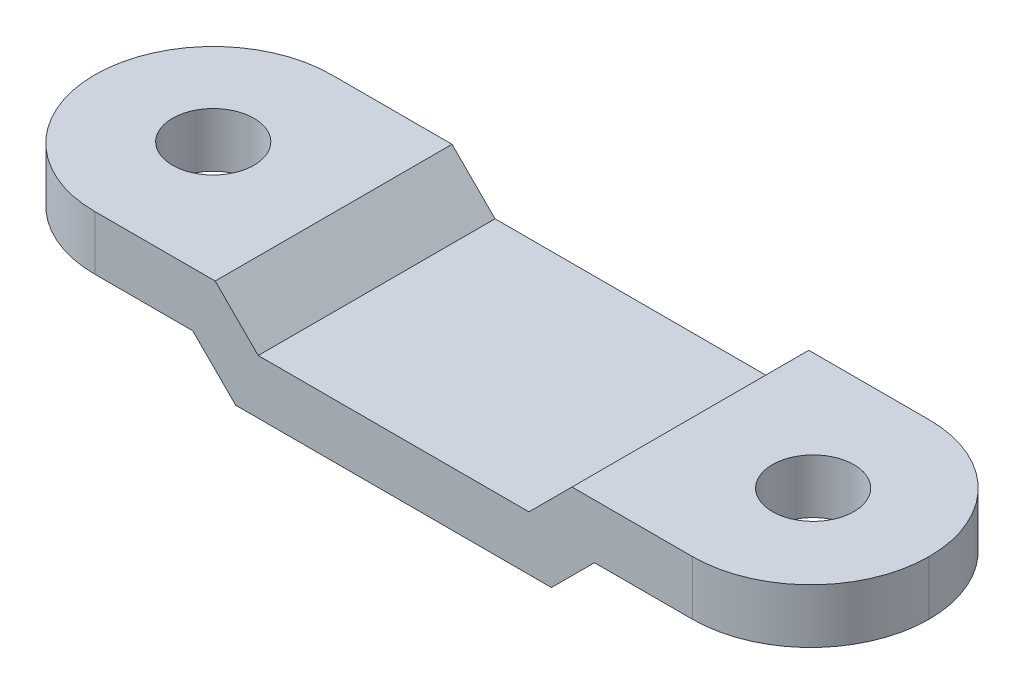
ISO-10303-21;
HEADER;
FILE_DESCRIPTION(('STEP AP214'),'2;1');
FILE_NAME('part.step','',(''),(''),'','','');
FILE_SCHEMA(('AUTOMOTIVE_DESIGN { 1 0 10303 214 1 1 1 1 }'));
ENDSEC;
DATA;
#1=APPLICATION_CONTEXT('core data for automotive mechanical design processes');
#2=APPLICATION_PROTOCOL_DEFINITION('international standard','automotive_design',2000,#1);
#3=PRODUCT_CONTEXT('',#1,'mechanical');
#4=PRODUCT('Part','Part','',(#3));
#5=PRODUCT_RELATED_PRODUCT_CATEGORY('part','',(#4));
#6=PRODUCT_DEFINITION_FORMATION('','',#4);
#7=PRODUCT_DEFINITION_CONTEXT('part definition',#1,'design');
#8=PRODUCT_DEFINITION('design','',#6,#7);
#9=PRODUCT_DEFINITION_SHAPE('','',#8);
#10=(LENGTH_UNIT() NAMED_UNIT(*) SI_UNIT(.MILLI.,.METRE.));
#11=(NAMED_UNIT(*) PLANE_ANGLE_UNIT() SI_UNIT($,.RADIAN.));
#12=(NAMED_UNIT(*) SI_UNIT($,.STERADIAN.) SOLID_ANGLE_UNIT());
#13=UNCERTAINTY_MEASURE_WITH_UNIT(LENGTH_MEASURE(1.E-05),#10,'distance_accuracy_value','');
#14=(GEOMETRIC_REPRESENTATION_CONTEXT(3) GLOBAL_UNCERTAINTY_ASSIGNED_CONTEXT((#13)) GLOBAL_UNIT_ASSIGNED_CONTEXT((#10,
#11,#12)) REPRESENTATION_CONTEXT('',''));
#15=CARTESIAN_POINT('',(0.,0.,0.));
#16=DIRECTION('',(0.,0.,1.));
#17=DIRECTION('',(1.,0.,0.));
#18=AXIS2_PLACEMENT_3D('',#15,#16,#17);
#19=CARTESIAN_POINT('',(-8.34208755157234,-2.54,11.0744));
#20=DIRECTION('',(0.,-1.,0.));
#21=DIRECTION('',(1.,0.,0.));
#22=AXIS2_PLACEMENT_3D('',#19,#20,#21);
#23=PLANE('',#22);
#24=CARTESIAN_POINT('',(-14.0266075515724,-2.54,5.4816273019469));
#25=DIRECTION('',(0.,1.,0.));
#26=DIRECTION('',(-1.,0.,0.));
#27=AXIS2_PLACEMENT_3D('',#24,#25,#26);
#28=CIRCLE('',#27,1.90500000000001);
#29=CARTESIAN_POINT('',(-15.9316075515724,-2.54,5.4816273019469));
#30=VERTEX_POINT('',#29);
#31=EDGE_CURVE('E230',#30,#30,#28,.T.);
#32=ORIENTED_EDGE('',*,*,#31,.F.);
#33=EDGE_LOOP('',(#32));
#34=FACE_BOUND('',#33,.T.);
#35=CARTESIAN_POINT('',(-13.9707275515724,-2.54,5.5372));
#36=DIRECTION('',(0.,-1.,0.));
#37=DIRECTION('',(1.,0.,0.));
#38=AXIS2_PLACEMENT_3D('',#35,#36,#37);
#39=CIRCLE('',#38,5.5372);
#40=CARTESIAN_POINT('',(-13.9707275515724,-2.54,0.));
#41=VERTEX_POINT('',#40);
#42=CARTESIAN_POINT('',(-19.5079275515724,-2.54,5.5372));
#43=VERTEX_POINT('',#42);
#44=EDGE_CURVE('E64',#41,#43,#39,.F.);
#45=ORIENTED_EDGE('',*,*,#44,.T.);
#46=CARTESIAN_POINT('',(-13.9707275515724,-2.54,5.5372));
#47=DIRECTION('',(0.,-1.,0.));
#48=DIRECTION('',(1.,0.,0.));
#49=AXIS2_PLACEMENT_3D('',#46,#47,#48);
#50=CIRCLE('',#49,5.5372);
#51=CARTESIAN_POINT('',(-13.9707275515724,-2.54,11.0744));
#52=VERTEX_POINT('',#51);
#53=EDGE_CURVE('E248',#43,#52,#50,.F.);
#54=ORIENTED_EDGE('',*,*,#53,.T.);
#55=DIRECTION('',(-1.,0.,0.));
#56=VECTOR('',#55,1.);
#57=CARTESIAN_POINT('',(-8.34208755157234,-2.54,11.0744));
#58=LINE('',#57,#56);
#59=CARTESIAN_POINT('',(-8.34208755157234,-2.54,11.0744));
#60=VERTEX_POINT('',#59);
#61=EDGE_CURVE('E167',#60,#52,#58,.T.);
#62=ORIENTED_EDGE('',*,*,#61,.F.);
#63=DIRECTION('',(0.,0.,-1.));
#64=VECTOR('',#63,1.);
#65=CARTESIAN_POINT('',(-8.34208755157234,-2.54,11.0744));
#66=LINE('',#65,#64);
#67=CARTESIAN_POINT('',(-8.34208755157234,-2.54,0.));
#68=VERTEX_POINT('',#67);
#69=EDGE_CURVE('E188',#60,#68,#66,.T.);
#70=ORIENTED_EDGE('',*,*,#69,.T.);
#71=DIRECTION('',(-1.,0.,0.));
#72=VECTOR('',#71,1.);
#73=CARTESIAN_POINT('',(-8.34208755157234,-2.54,0.));
#74=LINE('',#73,#72);
#75=EDGE_CURVE('E189',#68,#41,#74,.T.);
#76=ORIENTED_EDGE('',*,*,#75,.T.);
#77=EDGE_LOOP('',(#45,#54,#62,#70,#76));
#78=FACE_BOUND('',#77,.T.);
#79=ADVANCED_FACE('F41',(#34,#78),#23,.F.);
#80=CARTESIAN_POINT('',(-9.39419,-5.08,11.0744));
#81=DIRECTION('',(0.,-1.,0.));
#82=DIRECTION('',(0.,0.,-1.));
#83=AXIS2_PLACEMENT_3D('',#80,#81,#82);
#84=PLANE('',#83);
#85=CARTESIAN_POINT('',(-14.0266075515724,-5.08,5.4816273019469));
#86=DIRECTION('',(0.,-1.,0.));
#87=DIRECTION('',(0.,0.,-1.));
#88=AXIS2_PLACEMENT_3D('',#85,#86,#87);
#89=CIRCLE('',#88,1.90500000000001);
#90=CARTESIAN_POINT('',(-15.9316075515724,-5.08,5.4816273019469));
#91=VERTEX_POINT('',#90);
#92=EDGE_CURVE('E191',#91,#91,#89,.T.);
#93=ORIENTED_EDGE('',*,*,#92,.F.);
#94=EDGE_LOOP('',(#93));
#95=FACE_BOUND('',#94,.T.);
#96=DIRECTION('',(-1.,0.,0.));
#97=VECTOR('',#96,1.);
#98=CARTESIAN_POINT('',(-9.39419,-5.08,11.0744));
#99=LINE('',#98,#97);
#100=CARTESIAN_POINT('',(-9.39419,-5.08,11.0744));
#101=VERTEX_POINT('',#100);
#102=CARTESIAN_POINT('',(-13.9707275515723,-5.08,11.0744));
#103=VERTEX_POINT('',#102);
#104=EDGE_CURVE('E145',#101,#103,#99,.T.);
#105=ORIENTED_EDGE('',*,*,#104,.T.);
#106=CARTESIAN_POINT('',(-13.9707275515723,-5.08,5.5372));
#107=DIRECTION('',(0.,-1.,0.));
#108=DIRECTION('',(0.,0.,-1.));
#109=AXIS2_PLACEMENT_3D('',#106,#107,#108);
#110=CIRCLE('',#109,5.5372);
#111=CARTESIAN_POINT('',(-19.5079275515723,-5.08,5.5372));
#112=VERTEX_POINT('',#111);
#113=EDGE_CURVE('E11',#103,#112,#110,.T.);
#114=ORIENTED_EDGE('',*,*,#113,.T.);
#115=CARTESIAN_POINT('',(-13.9707275515723,-5.08,5.5372));
#116=DIRECTION('',(0.,-1.,0.));
#117=DIRECTION('',(0.,0.,-1.));
#118=AXIS2_PLACEMENT_3D('',#115,#116,#117);
#119=CIRCLE('',#118,5.5372);
#120=CARTESIAN_POINT('',(-13.9707275515723,-5.08,0.));
#121=VERTEX_POINT('',#120);
#122=EDGE_CURVE('E50',#112,#121,#119,.T.);
#123=ORIENTED_EDGE('',*,*,#122,.T.);
#124=DIRECTION('',(-1.,0.,0.));
#125=VECTOR('',#124,1.);
#126=CARTESIAN_POINT('',(-9.39419,-5.08,0.));
#127=LINE('',#126,#125);
#128=CARTESIAN_POINT('',(-9.39419,-5.08,0.));
#129=VERTEX_POINT('',#128);
#130=EDGE_CURVE('E147',#129,#121,#127,.T.);
#131=ORIENTED_EDGE('',*,*,#130,.F.);
#132=DIRECTION('',(0.,0.,-1.));
#133=VECTOR('',#132,1.);
#134=CARTESIAN_POINT('',(-9.39419,-5.08,11.0744));
#135=LINE('',#134,#133);
#136=EDGE_CURVE('E141',#101,#129,#135,.T.);
#137=ORIENTED_EDGE('',*,*,#136,.F.);
#138=EDGE_LOOP('',(#105,#114,#123,#131,#137));
#139=FACE_BOUND('',#138,.T.);
#140=ADVANCED_FACE('F143',(#95,#139),#84,.T.);
#141=CARTESIAN_POINT('',(-9.39419,-5.08,11.0744));
#142=DIRECTION('',(0.707106781186545,0.70710678118655,0.));
#143=DIRECTION('',(-0.70710678118655,0.707106781186545,0.));
#144=AXIS2_PLACEMENT_3D('',#141,#142,#143);
#145=PLANE('',#144);
#146=DIRECTION('',(0.70710678118655,-0.707106781186545,0.));
#147=VECTOR('',#146,1.);
#148=CARTESIAN_POINT('',(-9.39419,-5.08,0.));
#149=LINE('',#148,#147);
#150=CARTESIAN_POINT('',(-7.38250999999998,-7.09168,0.));
#151=VERTEX_POINT('',#150);
#152=EDGE_CURVE('E193',#129,#151,#149,.T.);
#153=ORIENTED_EDGE('',*,*,#152,.T.);
#154=DIRECTION('',(0.,0.,-1.));
#155=VECTOR('',#154,1.);
#156=CARTESIAN_POINT('',(-7.38250999999998,-7.09168,11.0744));
#157=LINE('',#156,#155);
#158=CARTESIAN_POINT('',(-7.38250999999998,-7.09168,11.0744));
#159=VERTEX_POINT('',#158);
#160=EDGE_CURVE('E152',#159,#151,#157,.T.);
#161=ORIENTED_EDGE('',*,*,#160,.F.);
#162=DIRECTION('',(0.70710678118655,-0.707106781186545,0.));
#163=VECTOR('',#162,1.);
#164=CARTESIAN_POINT('',(-9.39419,-5.08,11.0744));
#165=LINE('',#164,#163);
#166=EDGE_CURVE('E155',#101,#159,#165,.T.);
#167=ORIENTED_EDGE('',*,*,#166,.F.);
#168=ORIENTED_EDGE('',*,*,#136,.T.);
#169=EDGE_LOOP('',(#153,#161,#167,#168));
#170=FACE_BOUND('',#169,.T.);
#171=ADVANCED_FACE('F156',(#170),#145,.F.);
#172=CARTESIAN_POINT('',(7.38251000000001,-7.09168,11.0744));
#173=DIRECTION('',(0.,-1.,0.));
#174=DIRECTION('',(1.,0.,0.));
#175=AXIS2_PLACEMENT_3D('',#172,#173,#174);
#176=PLANE('',#175);
#177=DIRECTION('',(-1.,0.,0.));
#178=VECTOR('',#177,1.);
#179=CARTESIAN_POINT('',(7.38251000000001,-7.09168,0.));
#180=LINE('',#179,#178);
#181=CARTESIAN_POINT('',(7.38251000000001,-7.09168,0.));
#182=VERTEX_POINT('',#181);
#183=EDGE_CURVE('E195',#182,#151,#180,.T.);
#184=ORIENTED_EDGE('',*,*,#183,.F.);
#185=DIRECTION('',(0.,0.,-1.));
#186=VECTOR('',#185,1.);
#187=CARTESIAN_POINT('',(7.38251000000001,-7.09168,11.0744));
#188=LINE('',#187,#186);
#189=CARTESIAN_POINT('',(7.38251000000001,-7.09168,11.0744));
#190=VERTEX_POINT('',#189);
#191=EDGE_CURVE('E224',#190,#182,#188,.T.);
#192=ORIENTED_EDGE('',*,*,#191,.F.);
#193=DIRECTION('',(-1.,0.,0.));
#194=VECTOR('',#193,1.);
#195=CARTESIAN_POINT('',(7.38251000000001,-7.09168,11.0744));
#196=LINE('',#195,#194);
#197=EDGE_CURVE('E160',#190,#159,#196,.T.);
#198=ORIENTED_EDGE('',*,*,#197,.T.);
#199=ORIENTED_EDGE('',*,*,#160,.T.);
#200=EDGE_LOOP('',(#184,#192,#198,#199));
#201=FACE_BOUND('',#200,.T.);
#202=ADVANCED_FACE('F272',(#201),#176,.T.);
#203=CARTESIAN_POINT('',(9.39419,-5.08,11.0744));
#204=DIRECTION('',(0.70710678118655,-0.707106781186545,0.));
#205=DIRECTION('',(0.707106781186545,0.70710678118655,0.));
#206=AXIS2_PLACEMENT_3D('',#203,#204,#205);
#207=PLANE('',#206);
#208=DIRECTION('',(-0.707106781186545,-0.70710678118655,0.));
#209=VECTOR('',#208,1.);
#210=CARTESIAN_POINT('',(9.39419,-5.08,0.));
#211=LINE('',#210,#209);
#212=CARTESIAN_POINT('',(9.39419,-5.08,0.));
#213=VERTEX_POINT('',#212);
#214=EDGE_CURVE('E198',#213,#182,#211,.T.);
#215=ORIENTED_EDGE('',*,*,#214,.F.);
#216=DIRECTION('',(0.,0.,-1.));
#217=VECTOR('',#216,1.);
#218=CARTESIAN_POINT('',(9.39419,-5.08,11.0744));
#219=LINE('',#218,#217);
#220=CARTESIAN_POINT('',(9.39419,-5.08,11.0744));
#221=VERTEX_POINT('',#220);
#222=EDGE_CURVE('E221',#221,#213,#219,.T.);
#223=ORIENTED_EDGE('',*,*,#222,.F.);
#224=DIRECTION('',(-0.707106781186545,-0.70710678118655,0.));
#225=VECTOR('',#224,1.);
#226=CARTESIAN_POINT('',(9.39419,-5.08,11.0744));
#227=LINE('',#226,#225);
#228=EDGE_CURVE('E174',#221,#190,#227,.T.);
#229=ORIENTED_EDGE('',*,*,#228,.T.);
#230=ORIENTED_EDGE('',*,*,#191,.T.);
#231=EDGE_LOOP('',(#215,#223,#229,#230));
#232=FACE_BOUND('',#231,.T.);
#233=ADVANCED_FACE('F276',(#232),#207,.T.);
#234=CARTESIAN_POINT('',(19.5079275515724,-5.08,11.0744));
#235=DIRECTION('',(0.,-1.,0.));
#236=DIRECTION('',(0.,0.,-1.));
#237=AXIS2_PLACEMENT_3D('',#234,#235,#236);
#238=PLANE('',#237);
#239=CARTESIAN_POINT('',(14.0266075515724,-5.08,5.4816273019469));
#240=DIRECTION('',(0.,-1.,0.));
#241=DIRECTION('',(0.,0.,-1.));
#242=AXIS2_PLACEMENT_3D('',#239,#240,#241);
#243=CIRCLE('',#242,1.90500000000001);
#244=CARTESIAN_POINT('',(12.1216075515723,-5.08,5.4816273019469));
#245=VERTEX_POINT('',#244);
#246=EDGE_CURVE('E257',#245,#245,#243,.F.);
#247=ORIENTED_EDGE('',*,*,#246,.T.);
#248=EDGE_LOOP('',(#247));
#249=FACE_BOUND('',#248,.T.);
#250=CARTESIAN_POINT('',(13.9707275515724,-5.08,5.5372));
#251=DIRECTION('',(0.,-1.,0.));
#252=DIRECTION('',(0.,0.,-1.));
#253=AXIS2_PLACEMENT_3D('',#250,#251,#252);
#254=CIRCLE('',#253,5.5372);
#255=CARTESIAN_POINT('',(13.9707275515724,-5.08,0.));
#256=VERTEX_POINT('',#255);
#257=CARTESIAN_POINT('',(19.5079275515724,-5.08,5.5372));
#258=VERTEX_POINT('',#257);
#259=EDGE_CURVE('E239',#256,#258,#254,.T.);
#260=ORIENTED_EDGE('',*,*,#259,.T.);
#261=CARTESIAN_POINT('',(13.9707275515724,-5.08,5.5372));
#262=DIRECTION('',(0.,-1.,0.));
#263=DIRECTION('',(0.,0.,-1.));
#264=AXIS2_PLACEMENT_3D('',#261,#262,#263);
#265=CIRCLE('',#264,5.5372);
#266=CARTESIAN_POINT('',(13.9707275515724,-5.08,11.0744));
#267=VERTEX_POINT('',#266);
#268=EDGE_CURVE('E241',#258,#267,#265,.T.);
#269=ORIENTED_EDGE('',*,*,#268,.T.);
#270=DIRECTION('',(-1.,0.,0.));
#271=VECTOR('',#270,1.);
#272=CARTESIAN_POINT('',(19.5079275515724,-5.08,11.0744));
#273=LINE('',#272,#271);
#274=EDGE_CURVE('E177',#267,#221,#273,.T.);
#275=ORIENTED_EDGE('',*,*,#274,.T.);
#276=ORIENTED_EDGE('',*,*,#222,.T.);
#277=DIRECTION('',(-1.,0.,0.));
#278=VECTOR('',#277,1.);
#279=CARTESIAN_POINT('',(19.5079275515724,-5.08,0.));
#280=LINE('',#279,#278);
#281=EDGE_CURVE('E201',#256,#213,#280,.T.);
#282=ORIENTED_EDGE('',*,*,#281,.F.);
#283=EDGE_LOOP('',(#260,#269,#275,#276,#282));
#284=FACE_BOUND('',#283,.T.);
#285=ADVANCED_FACE('F279',(#249,#284),#238,.T.);
#286=CARTESIAN_POINT('',(19.5079275515724,-2.54,11.0744));
#287=DIRECTION('',(0.,-1.,0.));
#288=DIRECTION('',(1.,0.,0.));
#289=AXIS2_PLACEMENT_3D('',#286,#287,#288);
#290=PLANE('',#289);
#291=CARTESIAN_POINT('',(14.0266075515724,-2.54,5.4816273019469));
#292=DIRECTION('',(0.,-1.,0.));
#293=DIRECTION('',(1.,0.,0.));
#294=AXIS2_PLACEMENT_3D('',#291,#292,#293);
#295=CIRCLE('',#294,1.90500000000001);
#296=CARTESIAN_POINT('',(12.1216075515723,-2.54,5.4816273019469));
#297=VERTEX_POINT('',#296);
#298=EDGE_CURVE('E252',#297,#297,#295,.T.);
#299=ORIENTED_EDGE('',*,*,#298,.T.);
#300=EDGE_LOOP('',(#299));
#301=FACE_BOUND('',#300,.T.);
#302=DIRECTION('',(-1.,0.,0.));
#303=VECTOR('',#302,1.);
#304=CARTESIAN_POINT('',(19.5079275515724,-2.54,11.0744));
#305=LINE('',#304,#303);
#306=CARTESIAN_POINT('',(13.9707275515724,-2.54,11.0744));
#307=VERTEX_POINT('',#306);
#308=CARTESIAN_POINT('',(8.34208755157234,-2.54,11.0744));
#309=VERTEX_POINT('',#308);
#310=EDGE_CURVE('E179',#307,#309,#305,.T.);
#311=ORIENTED_EDGE('',*,*,#310,.F.);
#312=CARTESIAN_POINT('',(13.9707275515724,-2.54,5.5372));
#313=DIRECTION('',(0.,-1.,0.));
#314=DIRECTION('',(1.,0.,0.));
#315=AXIS2_PLACEMENT_3D('',#312,#313,#314);
#316=CIRCLE('',#315,5.5372);
#317=CARTESIAN_POINT('',(19.5079275515724,-2.54,5.5372));
#318=VERTEX_POINT('',#317);
#319=EDGE_CURVE('E237',#307,#318,#316,.F.);
#320=ORIENTED_EDGE('',*,*,#319,.T.);
#321=CARTESIAN_POINT('',(13.9707275515724,-2.54,5.5372));
#322=DIRECTION('',(0.,-1.,0.));
#323=DIRECTION('',(1.,0.,0.));
#324=AXIS2_PLACEMENT_3D('',#321,#322,#323);
#325=CIRCLE('',#324,5.5372);
#326=CARTESIAN_POINT('',(13.9707275515724,-2.54,0.));
#327=VERTEX_POINT('',#326);
#328=EDGE_CURVE('E235',#318,#327,#325,.F.);
#329=ORIENTED_EDGE('',*,*,#328,.T.);
#330=DIRECTION('',(-1.,0.,0.));
#331=VECTOR('',#330,1.);
#332=CARTESIAN_POINT('',(19.5079275515724,-2.54,0.));
#333=LINE('',#332,#331);
#334=CARTESIAN_POINT('',(8.34208755157234,-2.54,0.));
#335=VERTEX_POINT('',#334);
#336=EDGE_CURVE('E203',#327,#335,#333,.T.);
#337=ORIENTED_EDGE('',*,*,#336,.T.);
#338=DIRECTION('',(0.,0.,-1.));
#339=VECTOR('',#338,1.);
#340=CARTESIAN_POINT('',(8.34208755157234,-2.54,11.0744));
#341=LINE('',#340,#339);
#342=EDGE_CURVE('E218',#309,#335,#341,.T.);
#343=ORIENTED_EDGE('',*,*,#342,.F.);
#344=EDGE_LOOP('',(#311,#320,#329,#337,#343));
#345=FACE_BOUND('',#344,.T.);
#346=ADVANCED_FACE('F286',(#301,#345),#290,.F.);
#347=CARTESIAN_POINT('',(8.34208755157234,-2.54,11.0744));
#348=DIRECTION('',(0.707106781186549,-0.707106781186545,0.));
#349=DIRECTION('',(0.707106781186546,0.70710678118655,0.));
#350=AXIS2_PLACEMENT_3D('',#347,#348,#349);
#351=PLANE('',#350);
#352=DIRECTION('',(-0.707106781186545,-0.707106781186549,0.));
#353=VECTOR('',#352,1.);
#354=CARTESIAN_POINT('',(8.34208755157234,-2.54,0.));
#355=LINE('',#354,#353);
#356=CARTESIAN_POINT('',(6.33040755157235,-4.55168,0.));
#357=VERTEX_POINT('',#356);
#358=EDGE_CURVE('E205',#335,#357,#355,.T.);
#359=ORIENTED_EDGE('',*,*,#358,.T.);
#360=DIRECTION('',(0.,0.,-1.));
#361=VECTOR('',#360,1.);
#362=CARTESIAN_POINT('',(6.33040755157235,-4.55168,11.0744));
#363=LINE('',#362,#361);
#364=CARTESIAN_POINT('',(6.33040755157235,-4.55168,11.0744));
#365=VERTEX_POINT('',#364);
#366=EDGE_CURVE('E215',#365,#357,#363,.T.);
#367=ORIENTED_EDGE('',*,*,#366,.F.);
#368=DIRECTION('',(-0.707106781186545,-0.707106781186549,0.));
#369=VECTOR('',#368,1.);
#370=CARTESIAN_POINT('',(8.34208755157234,-2.54,11.0744));
#371=LINE('',#370,#369);
#372=EDGE_CURVE('E181',#309,#365,#371,.T.);
#373=ORIENTED_EDGE('',*,*,#372,.F.);
#374=ORIENTED_EDGE('',*,*,#342,.T.);
#375=EDGE_LOOP('',(#359,#367,#373,#374));
#376=FACE_BOUND('',#375,.T.);
#377=ADVANCED_FACE('F295',(#376),#351,.F.);
#378=CARTESIAN_POINT('',(6.33040755157235,-4.55168,11.0744));
#379=DIRECTION('',(0.,-1.,0.));
#380=DIRECTION('',(0.,0.,-1.));
#381=AXIS2_PLACEMENT_3D('',#378,#379,#380);
#382=PLANE('',#381);
#383=DIRECTION('',(-1.,0.,0.));
#384=VECTOR('',#383,1.);
#385=CARTESIAN_POINT('',(6.33040755157235,-4.55168,0.));
#386=LINE('',#385,#384);
#387=CARTESIAN_POINT('',(-6.33040755157235,-4.55168,0.));
#388=VERTEX_POINT('',#387);
#389=EDGE_CURVE('E207',#357,#388,#386,.T.);
#390=ORIENTED_EDGE('',*,*,#389,.T.);
#391=DIRECTION('',(0.,0.,-1.));
#392=VECTOR('',#391,1.);
#393=CARTESIAN_POINT('',(-6.33040755157235,-4.55168,11.0744));
#394=LINE('',#393,#392);
#395=CARTESIAN_POINT('',(-6.33040755157235,-4.55168,11.0744));
#396=VERTEX_POINT('',#395);
#397=EDGE_CURVE('E213',#396,#388,#394,.T.);
#398=ORIENTED_EDGE('',*,*,#397,.F.);
#399=DIRECTION('',(-1.,0.,0.));
#400=VECTOR('',#399,1.);
#401=CARTESIAN_POINT('',(6.33040755157235,-4.55168,11.0744));
#402=LINE('',#401,#400);
#403=EDGE_CURVE('E183',#365,#396,#402,.T.);
#404=ORIENTED_EDGE('',*,*,#403,.F.);
#405=ORIENTED_EDGE('',*,*,#366,.T.);
#406=EDGE_LOOP('',(#390,#398,#404,#405));
#407=FACE_BOUND('',#406,.T.);
#408=ADVANCED_FACE('F301',(#407),#382,.F.);
#409=CARTESIAN_POINT('',(-8.34208755157234,-2.54,11.0744));
#410=DIRECTION('',(0.707106781186549,0.707106781186545,0.));
#411=DIRECTION('',(-0.707106781186546,0.70710678118655,0.));
#412=AXIS2_PLACEMENT_3D('',#409,#410,#411);
#413=PLANE('',#412);
#414=DIRECTION('',(0.707106781186545,-0.707106781186549,0.));
#415=VECTOR('',#414,1.);
#416=CARTESIAN_POINT('',(-8.34208755157234,-2.54,0.));
#417=LINE('',#416,#415);
#418=EDGE_CURVE('E169',#68,#388,#417,.T.);
#419=ORIENTED_EDGE('',*,*,#418,.F.);
#420=ORIENTED_EDGE('',*,*,#69,.F.);
#421=DIRECTION('',(0.707106781186545,-0.707106781186549,0.));
#422=VECTOR('',#421,1.);
#423=CARTESIAN_POINT('',(-8.34208755157234,-2.54,11.0744));
#424=LINE('',#423,#422);
#425=EDGE_CURVE('E185',#60,#396,#424,.T.);
#426=ORIENTED_EDGE('',*,*,#425,.T.);
#427=ORIENTED_EDGE('',*,*,#397,.T.);
#428=EDGE_LOOP('',(#419,#420,#426,#427));
#429=FACE_BOUND('',#428,.T.);
#430=ADVANCED_FACE('F304',(#429),#413,.T.);
#431=CARTESIAN_POINT('',(19.5079275515724,-2.54,11.0744));
#432=DIRECTION('',(0.,0.,-1.));
#433=DIRECTION('',(-1.,0.,0.));
#434=AXIS2_PLACEMENT_3D('',#431,#432,#433);
#435=PLANE('',#434);
#436=ORIENTED_EDGE('',*,*,#274,.F.);
#437=DIRECTION('',(0.,1.,0.));
#438=VECTOR('',#437,1.);
#439=CARTESIAN_POINT('',(13.9707275515724,-2.54,11.0744));
#440=LINE('',#439,#438);
#441=EDGE_CURVE('E232',#267,#307,#440,.T.);
#442=ORIENTED_EDGE('',*,*,#441,.T.);
#443=ORIENTED_EDGE('',*,*,#310,.T.);
#444=ORIENTED_EDGE('',*,*,#372,.T.);
#445=ORIENTED_EDGE('',*,*,#403,.T.);
#446=ORIENTED_EDGE('',*,*,#425,.F.);
#447=ORIENTED_EDGE('',*,*,#61,.T.);
#448=DIRECTION('',(0.,1.,0.));
#449=VECTOR('',#448,1.);
#450=CARTESIAN_POINT('',(-13.9707275515723,-5.07999999999994,11.0744));
#451=LINE('',#450,#449);
#452=EDGE_CURVE('E151',#52,#103,#451,.F.);
#453=ORIENTED_EDGE('',*,*,#452,.T.);
#454=ORIENTED_EDGE('',*,*,#104,.F.);
#455=ORIENTED_EDGE('',*,*,#166,.T.);
#456=ORIENTED_EDGE('',*,*,#197,.F.);
#457=ORIENTED_EDGE('',*,*,#228,.F.);
#458=EDGE_LOOP('',(#436,#442,#443,#444,#445,#446,#447,#453,#454,#455,#456,#457));
#459=FACE_BOUND('',#458,.T.);
#460=ADVANCED_FACE('F164',(#459),#435,.F.);
#461=CARTESIAN_POINT('',(19.5079275515724,-2.54,0.));
#462=DIRECTION('',(0.,0.,-1.));
#463=DIRECTION('',(-1.,0.,0.));
#464=AXIS2_PLACEMENT_3D('',#461,#462,#463);
#465=PLANE('',#464);
#466=ORIENTED_EDGE('',*,*,#336,.F.);
#467=DIRECTION('',(0.,1.,0.));
#468=VECTOR('',#467,1.);
#469=CARTESIAN_POINT('',(13.9707275515724,-5.08,0.));
#470=LINE('',#469,#468);
#471=EDGE_CURVE('E245',#327,#256,#470,.F.);
#472=ORIENTED_EDGE('',*,*,#471,.T.);
#473=ORIENTED_EDGE('',*,*,#281,.T.);
#474=ORIENTED_EDGE('',*,*,#214,.T.);
#475=ORIENTED_EDGE('',*,*,#183,.T.);
#476=ORIENTED_EDGE('',*,*,#152,.F.);
#477=ORIENTED_EDGE('',*,*,#130,.T.);
#478=DIRECTION('',(0.,1.,0.));
#479=VECTOR('',#478,1.);
#480=CARTESIAN_POINT('',(-13.9707275515724,-2.54000000000037,0.));
#481=LINE('',#480,#479);
#482=EDGE_CURVE('E243',#121,#41,#481,.T.);
#483=ORIENTED_EDGE('',*,*,#482,.T.);
#484=ORIENTED_EDGE('',*,*,#75,.F.);
#485=ORIENTED_EDGE('',*,*,#418,.T.);
#486=ORIENTED_EDGE('',*,*,#389,.F.);
#487=ORIENTED_EDGE('',*,*,#358,.F.);
#488=EDGE_LOOP('',(#466,#472,#473,#474,#475,#476,#477,#483,#484,#485,#486,#487));
#489=FACE_BOUND('',#488,.T.);
#490=ADVANCED_FACE('F267',(#489),#465,.T.);
#491=CARTESIAN_POINT('',(-14.0266075515724,-7.09168,5.4816273019469));
#492=DIRECTION('',(0.,1.,0.));
#493=DIRECTION('',(-1.,0.,0.));
#494=AXIS2_PLACEMENT_3D('',#491,#492,#493);
#495=CYLINDRICAL_SURFACE('',#494,1.90500000000001);
#496=CARTESIAN_POINT('',(-15.9316075515724,-5.08,5.4816273019469));
#497=CARTESIAN_POINT('',(-15.9316075515724,-5.05354166666667,5.4816273019469));
#498=CARTESIAN_POINT('',(-15.9316075515724,-5.02708333333334,5.4816273019469));
#499=CARTESIAN_POINT('',(-15.9316075515724,-4.97416666666667,5.4816273019469));
#500=CARTESIAN_POINT('',(-15.9316075515724,-4.94770833333334,5.4816273019469));
#501=CARTESIAN_POINT('',(-15.9316075515724,-4.89479166666667,5.4816273019469));
#502=CARTESIAN_POINT('',(-15.9316075515724,-4.86833333333334,5.4816273019469));
#503=CARTESIAN_POINT('',(-15.9316075515724,-4.81541666666667,5.4816273019469));
#504=CARTESIAN_POINT('',(-15.9316075515724,-4.78895833333334,5.4816273019469));
#505=CARTESIAN_POINT('',(-15.9316075515724,-4.73604166666667,5.4816273019469));
#506=CARTESIAN_POINT('',(-15.9316075515724,-4.70958333333334,5.4816273019469));
#507=CARTESIAN_POINT('',(-15.9316075515724,-4.65666666666667,5.4816273019469));
#508=CARTESIAN_POINT('',(-15.9316075515724,-4.63020833333333,5.4816273019469));
#509=CARTESIAN_POINT('',(-15.9316075515724,-4.57729166666667,5.4816273019469));
#510=CARTESIAN_POINT('',(-15.9316075515724,-4.55083333333334,5.4816273019469));
#511=CARTESIAN_POINT('',(-15.9316075515724,-4.49791666666667,5.4816273019469));
#512=CARTESIAN_POINT('',(-15.9316075515724,-4.47145833333334,5.4816273019469));
#513=CARTESIAN_POINT('',(-15.9316075515724,-4.41854166666667,5.4816273019469));
#514=CARTESIAN_POINT('',(-15.9316075515724,-4.39208333333334,5.4816273019469));
#515=CARTESIAN_POINT('',(-15.9316075515724,-4.33916666666667,5.4816273019469));
#516=CARTESIAN_POINT('',(-15.9316075515724,-4.31270833333333,5.4816273019469));
#517=CARTESIAN_POINT('',(-15.9316075515724,-4.25979166666667,5.4816273019469));
#518=CARTESIAN_POINT('',(-15.9316075515724,-4.23333333333334,5.4816273019469));
#519=CARTESIAN_POINT('',(-15.9316075515724,-4.18041666666667,5.4816273019469));
#520=CARTESIAN_POINT('',(-15.9316075515724,-4.15395833333334,5.4816273019469));
#521=CARTESIAN_POINT('',(-15.9316075515724,-4.10104166666667,5.4816273019469));
#522=CARTESIAN_POINT('',(-15.9316075515724,-4.07458333333334,5.4816273019469));
#523=CARTESIAN_POINT('',(-15.9316075515724,-4.02166666666667,5.4816273019469));
#524=CARTESIAN_POINT('',(-15.9316075515724,-3.99520833333334,5.4816273019469));
#525=CARTESIAN_POINT('',(-15.9316075515724,-3.94229166666667,5.4816273019469));
#526=CARTESIAN_POINT('',(-15.9316075515724,-3.91583333333334,5.4816273019469));
#527=CARTESIAN_POINT('',(-15.9316075515724,-3.86291666666667,5.4816273019469));
#528=CARTESIAN_POINT('',(-15.9316075515724,-3.83645833333334,5.4816273019469));
#529=CARTESIAN_POINT('',(-15.9316075515724,-3.78354166666667,5.4816273019469));
#530=CARTESIAN_POINT('',(-15.9316075515724,-3.75708333333334,5.4816273019469));
#531=CARTESIAN_POINT('',(-15.9316075515724,-3.70416666666667,5.4816273019469));
#532=CARTESIAN_POINT('',(-15.9316075515724,-3.67770833333334,5.4816273019469));
#533=CARTESIAN_POINT('',(-15.9316075515724,-3.62479166666667,5.4816273019469));
#534=CARTESIAN_POINT('',(-15.9316075515724,-3.59833333333334,5.4816273019469));
#535=CARTESIAN_POINT('',(-15.9316075515724,-3.54541666666667,5.4816273019469));
#536=CARTESIAN_POINT('',(-15.9316075515724,-3.51895833333334,5.4816273019469));
#537=CARTESIAN_POINT('',(-15.9316075515724,-3.46604166666667,5.4816273019469));
#538=CARTESIAN_POINT('',(-15.9316075515724,-3.43958333333334,5.4816273019469));
#539=CARTESIAN_POINT('',(-15.9316075515724,-3.38666666666667,5.4816273019469));
#540=CARTESIAN_POINT('',(-15.9316075515724,-3.36020833333334,5.4816273019469));
#541=CARTESIAN_POINT('',(-15.9316075515724,-3.30729166666667,5.4816273019469));
#542=CARTESIAN_POINT('',(-15.9316075515724,-3.28083333333334,5.4816273019469));
#543=CARTESIAN_POINT('',(-15.9316075515724,-3.22791666666667,5.4816273019469));
#544=CARTESIAN_POINT('',(-15.9316075515724,-3.20145833333334,5.4816273019469));
#545=CARTESIAN_POINT('',(-15.9316075515724,-3.14854166666667,5.4816273019469));
#546=CARTESIAN_POINT('',(-15.9316075515724,-3.12208333333334,5.4816273019469));
#547=CARTESIAN_POINT('',(-15.9316075515724,-3.06916666666667,5.4816273019469));
#548=CARTESIAN_POINT('',(-15.9316075515724,-3.04270833333334,5.4816273019469));
#549=CARTESIAN_POINT('',(-15.9316075515724,-2.98979166666667,5.4816273019469));
#550=CARTESIAN_POINT('',(-15.9316075515724,-2.96333333333334,5.4816273019469));
#551=CARTESIAN_POINT('',(-15.9316075515724,-2.91041666666667,5.4816273019469));
#552=CARTESIAN_POINT('',(-15.9316075515724,-2.88395833333334,5.4816273019469));
#553=CARTESIAN_POINT('',(-15.9316075515724,-2.83104166666667,5.4816273019469));
#554=CARTESIAN_POINT('',(-15.9316075515724,-2.80458333333334,5.4816273019469));
#555=CARTESIAN_POINT('',(-15.9316075515724,-2.75166666666667,5.4816273019469));
#556=CARTESIAN_POINT('',(-15.9316075515724,-2.72520833333334,5.4816273019469));
#557=CARTESIAN_POINT('',(-15.9316075515724,-2.67229166666667,5.4816273019469));
#558=CARTESIAN_POINT('',(-15.9316075515724,-2.64583333333334,5.4816273019469));
#559=CARTESIAN_POINT('',(-15.9316075515724,-2.59291666666667,5.4816273019469));
#560=CARTESIAN_POINT('',(-15.9316075515724,-2.56645833333334,5.4816273019469));
#561=CARTESIAN_POINT('',(-15.9316075515724,-2.54,5.4816273019469));
#562=B_SPLINE_CURVE_WITH_KNOTS('',3,(#496,#497,#498,#499,#500,#501,#502,#503,#504,#505,#506,
#507,#508,#509,#510,#511,#512,#513,#514,#515,#516,#517,#518,#519,#520,#521,#522,#523,#524,#525,
#526,#527,#528,#529,#530,#531,#532,#533,#534,#535,#536,#537,#538,#539,#540,#541,#542,#543,#544,
#545,#546,#547,#548,#549,#550,#551,#552,#553,#554,#555,#556,#557,#558,#559,#560,#561),
.UNSPECIFIED.,.F.,.F.,(4,2,2,2,2,2,2,2,2,2,2,2,2,2,2,2,2,2,2,2,2,2,2,2,2,2,2,2,2,2,2,2,4),(0.,
0.0793750000000004,0.158750000000001,0.238125,0.3175,0.396875000000001,0.476250000000001,
0.555625000000001,0.635,0.714375000000001,0.793750000000001,0.873125000000001,0.9525,1.031875,
1.11125,1.190625,1.27,1.349375,1.42875,1.508125,1.5875,1.666875,1.74625,1.825625,1.905,1.984375,
2.06375,2.143125,2.2225,2.301875,2.38125,2.460625,2.54),.UNSPECIFIED.);
#563=EDGE_CURVE('BSEAM342',#91,#30,#562,.T.);
#564=ORIENTED_EDGE('',*,*,#92,.T.);
#565=ORIENTED_EDGE('',*,*,#31,.T.);
#566=ORIENTED_EDGE('',*,*,#563,.T.);
#567=ORIENTED_EDGE('',*,*,#563,.F.);
#568=EDGE_LOOP('',(#564,#566,#565,#567));
#569=FACE_BOUND('',#568,.T.);
#570=ADVANCED_FACE('F342',(#569),#495,.F.);
#571=CARTESIAN_POINT('',(14.0266075515724,-7.09168,5.4816273019469));
#572=DIRECTION('',(0.,1.,0.));
#573=DIRECTION('',(-1.,0.,0.));
#574=AXIS2_PLACEMENT_3D('',#571,#572,#573);
#575=CYLINDRICAL_SURFACE('',#574,1.90500000000001);
#576=CARTESIAN_POINT('',(12.1216075515723,-5.08,5.4816273019469));
#577=CARTESIAN_POINT('',(12.1216075515723,-5.05354166666667,5.4816273019469));
#578=CARTESIAN_POINT('',(12.1216075515723,-5.02708333333334,5.4816273019469));
#579=CARTESIAN_POINT('',(12.1216075515723,-4.97416666666667,5.4816273019469));
#580=CARTESIAN_POINT('',(12.1216075515723,-4.94770833333334,5.4816273019469));
#581=CARTESIAN_POINT('',(12.1216075515723,-4.89479166666667,5.4816273019469));
#582=CARTESIAN_POINT('',(12.1216075515723,-4.86833333333334,5.4816273019469));
#583=CARTESIAN_POINT('',(12.1216075515723,-4.81541666666667,5.4816273019469));
#584=CARTESIAN_POINT('',(12.1216075515723,-4.78895833333334,5.4816273019469));
#585=CARTESIAN_POINT('',(12.1216075515723,-4.73604166666667,5.4816273019469));
#586=CARTESIAN_POINT('',(12.1216075515723,-4.70958333333334,5.4816273019469));
#587=CARTESIAN_POINT('',(12.1216075515723,-4.65666666666667,5.4816273019469));
#588=CARTESIAN_POINT('',(12.1216075515723,-4.63020833333334,5.4816273019469));
#589=CARTESIAN_POINT('',(12.1216075515723,-4.57729166666667,5.4816273019469));
#590=CARTESIAN_POINT('',(12.1216075515723,-4.55083333333334,5.4816273019469));
#591=CARTESIAN_POINT('',(12.1216075515723,-4.49791666666667,5.4816273019469));
#592=CARTESIAN_POINT('',(12.1216075515723,-4.47145833333334,5.4816273019469));
#593=CARTESIAN_POINT('',(12.1216075515723,-4.41854166666667,5.4816273019469));
#594=CARTESIAN_POINT('',(12.1216075515723,-4.39208333333334,5.4816273019469));
#595=CARTESIAN_POINT('',(12.1216075515723,-4.33916666666667,5.4816273019469));
#596=CARTESIAN_POINT('',(12.1216075515723,-4.31270833333334,5.4816273019469));
#597=CARTESIAN_POINT('',(12.1216075515723,-4.25979166666667,5.4816273019469));
#598=CARTESIAN_POINT('',(12.1216075515723,-4.23333333333334,5.4816273019469));
#599=CARTESIAN_POINT('',(12.1216075515723,-4.18041666666667,5.4816273019469));
#600=CARTESIAN_POINT('',(12.1216075515723,-4.15395833333334,5.4816273019469));
#601=CARTESIAN_POINT('',(12.1216075515723,-4.10104166666667,5.4816273019469));
#602=CARTESIAN_POINT('',(12.1216075515723,-4.07458333333334,5.4816273019469));
#603=CARTESIAN_POINT('',(12.1216075515723,-4.02166666666667,5.4816273019469));
#604=CARTESIAN_POINT('',(12.1216075515723,-3.99520833333334,5.4816273019469));
#605=CARTESIAN_POINT('',(12.1216075515723,-3.94229166666667,5.4816273019469));
#606=CARTESIAN_POINT('',(12.1216075515723,-3.91583333333334,5.4816273019469));
#607=CARTESIAN_POINT('',(12.1216075515723,-3.86291666666667,5.4816273019469));
#608=CARTESIAN_POINT('',(12.1216075515723,-3.83645833333334,5.4816273019469));
#609=CARTESIAN_POINT('',(12.1216075515723,-3.78354166666667,5.4816273019469));
#610=CARTESIAN_POINT('',(12.1216075515723,-3.75708333333334,5.4816273019469));
#611=CARTESIAN_POINT('',(12.1216075515723,-3.70416666666667,5.4816273019469));
#612=CARTESIAN_POINT('',(12.1216075515723,-3.67770833333334,5.4816273019469));
#613=CARTESIAN_POINT('',(12.1216075515723,-3.62479166666667,5.4816273019469));
#614=CARTESIAN_POINT('',(12.1216075515723,-3.59833333333334,5.4816273019469));
#615=CARTESIAN_POINT('',(12.1216075515723,-3.54541666666667,5.4816273019469));
#616=CARTESIAN_POINT('',(12.1216075515723,-3.51895833333334,5.4816273019469));
#617=CARTESIAN_POINT('',(12.1216075515723,-3.46604166666667,5.4816273019469));
#618=CARTESIAN_POINT('',(12.1216075515723,-3.43958333333334,5.4816273019469));
#619=CARTESIAN_POINT('',(12.1216075515723,-3.38666666666667,5.4816273019469));
#620=CARTESIAN_POINT('',(12.1216075515723,-3.36020833333334,5.4816273019469));
#621=CARTESIAN_POINT('',(12.1216075515723,-3.30729166666667,5.4816273019469));
#622=CARTESIAN_POINT('',(12.1216075515723,-3.28083333333334,5.4816273019469));
#623=CARTESIAN_POINT('',(12.1216075515723,-3.22791666666667,5.4816273019469));
#624=CARTESIAN_POINT('',(12.1216075515723,-3.20145833333334,5.4816273019469));
#625=CARTESIAN_POINT('',(12.1216075515723,-3.14854166666667,5.4816273019469));
#626=CARTESIAN_POINT('',(12.1216075515723,-3.12208333333334,5.4816273019469));
#627=CARTESIAN_POINT('',(12.1216075515723,-3.06916666666667,5.4816273019469));
#628=CARTESIAN_POINT('',(12.1216075515723,-3.04270833333334,5.4816273019469));
#629=CARTESIAN_POINT('',(12.1216075515723,-2.98979166666667,5.4816273019469));
#630=CARTESIAN_POINT('',(12.1216075515723,-2.96333333333334,5.4816273019469));
#631=CARTESIAN_POINT('',(12.1216075515723,-2.91041666666667,5.4816273019469));
#632=CARTESIAN_POINT('',(12.1216075515723,-2.88395833333334,5.4816273019469));
#633=CARTESIAN_POINT('',(12.1216075515723,-2.83104166666667,5.4816273019469));
#634=CARTESIAN_POINT('',(12.1216075515723,-2.80458333333334,5.4816273019469));
#635=CARTESIAN_POINT('',(12.1216075515723,-2.75166666666667,5.4816273019469));
#636=CARTESIAN_POINT('',(12.1216075515723,-2.72520833333334,5.4816273019469));
#637=CARTESIAN_POINT('',(12.1216075515723,-2.67229166666667,5.4816273019469));
#638=CARTESIAN_POINT('',(12.1216075515723,-2.64583333333334,5.4816273019469));
#639=CARTESIAN_POINT('',(12.1216075515723,-2.59291666666667,5.4816273019469));
#640=CARTESIAN_POINT('',(12.1216075515723,-2.56645833333334,5.4816273019469));
#641=CARTESIAN_POINT('',(12.1216075515723,-2.54,5.4816273019469));
#642=B_SPLINE_CURVE_WITH_KNOTS('',3,(#576,#577,#578,#579,#580,#581,#582,#583,#584,#585,#586,
#587,#588,#589,#590,#591,#592,#593,#594,#595,#596,#597,#598,#599,#600,#601,#602,#603,#604,#605,
#606,#607,#608,#609,#610,#611,#612,#613,#614,#615,#616,#617,#618,#619,#620,#621,#622,#623,#624,
#625,#626,#627,#628,#629,#630,#631,#632,#633,#634,#635,#636,#637,#638,#639,#640,#641),
.UNSPECIFIED.,.F.,.F.,(4,2,2,2,2,2,2,2,2,2,2,2,2,2,2,2,2,2,2,2,2,2,2,2,2,2,2,2,2,2,2,2,4),(0.,
0.0793750000000004,0.158750000000001,0.238125,0.3175,0.396875,0.47625,0.555625000000001,0.635,
0.714375,0.79375,0.873125000000001,0.9525,1.031875,1.11125,1.190625,1.27,1.349375,1.42875,
1.508125,1.5875,1.666875,1.74625,1.825625,1.905,1.984375,2.06375,2.143125,2.2225,2.301875,
2.38125,2.460625,2.54),.UNSPECIFIED.);
#643=EDGE_CURVE('BSEAM320',#245,#297,#642,.T.);
#644=ORIENTED_EDGE('',*,*,#246,.F.);
#645=ORIENTED_EDGE('',*,*,#298,.F.);
#646=ORIENTED_EDGE('',*,*,#643,.T.);
#647=ORIENTED_EDGE('',*,*,#643,.F.);
#648=EDGE_LOOP('',(#644,#646,#645,#647));
#649=FACE_BOUND('',#648,.T.);
#650=ADVANCED_FACE('F320',(#649),#575,.F.);
#651=CARTESIAN_POINT('',(13.9707275515724,-5.08,5.5372));
#652=DIRECTION('',(0.,-1.,0.));
#653=DIRECTION('',(0.,0.,-1.));
#654=AXIS2_PLACEMENT_3D('',#651,#652,#653);
#655=CYLINDRICAL_SURFACE('',#654,5.5372);
#656=DIRECTION('',(0.,1.,0.));
#657=VECTOR('',#656,1.);
#658=CARTESIAN_POINT('',(19.5079275515724,-2.54,5.5372));
#659=LINE('',#658,#657);
#660=EDGE_CURVE('E250',#258,#318,#659,.T.);
#661=ORIENTED_EDGE('',*,*,#660,.F.);
#662=ORIENTED_EDGE('',*,*,#259,.F.);
#663=ORIENTED_EDGE('',*,*,#471,.F.);
#664=ORIENTED_EDGE('',*,*,#328,.F.);
#665=EDGE_LOOP('',(#661,#662,#663,#664));
#666=FACE_BOUND('',#665,.T.);
#667=ADVANCED_FACE('F290',(#666),#655,.T.);
#668=CARTESIAN_POINT('',(13.9707275515724,-2.54,5.5372));
#669=DIRECTION('',(0.,1.,0.));
#670=DIRECTION('',(0.,0.,1.));
#671=AXIS2_PLACEMENT_3D('',#668,#669,#670);
#672=CYLINDRICAL_SURFACE('',#671,5.5372);
#673=ORIENTED_EDGE('',*,*,#268,.F.);
#674=ORIENTED_EDGE('',*,*,#660,.T.);
#675=ORIENTED_EDGE('',*,*,#319,.F.);
#676=ORIENTED_EDGE('',*,*,#441,.F.);
#677=EDGE_LOOP('',(#673,#674,#675,#676));
#678=FACE_BOUND('',#677,.T.);
#679=ADVANCED_FACE('F283',(#678),#672,.T.);
#680=CARTESIAN_POINT('',(-13.9707275515724,-2.54000000000037,5.5372));
#681=DIRECTION('',(0.,1.,0.));
#682=DIRECTION('',(-1.,0.,0.));
#683=AXIS2_PLACEMENT_3D('',#680,#681,#682);
#684=CYLINDRICAL_SURFACE('',#683,5.5372);
#685=ORIENTED_EDGE('',*,*,#482,.F.);
#686=ORIENTED_EDGE('',*,*,#122,.F.);
#687=DIRECTION('',(0.,1.,0.));
#688=VECTOR('',#687,1.);
#689=CARTESIAN_POINT('',(-19.5079275515723,-5.08,5.5372));
#690=LINE('',#689,#688);
#691=EDGE_CURVE('E45',#43,#112,#690,.F.);
#692=ORIENTED_EDGE('',*,*,#691,.F.);
#693=ORIENTED_EDGE('',*,*,#44,.F.);
#694=EDGE_LOOP('',(#685,#686,#692,#693));
#695=FACE_BOUND('',#694,.T.);
#696=ADVANCED_FACE('F43',(#695),#684,.T.);
#697=CARTESIAN_POINT('',(-13.9707275515723,-5.07999999999994,5.5372));
#698=DIRECTION('',(0.,-1.,0.));
#699=DIRECTION('',(1.,0.,0.));
#700=AXIS2_PLACEMENT_3D('',#697,#698,#699);
#701=CYLINDRICAL_SURFACE('',#700,5.5372);
#702=ORIENTED_EDGE('',*,*,#113,.F.);
#703=ORIENTED_EDGE('',*,*,#452,.F.);
#704=ORIENTED_EDGE('',*,*,#53,.F.);
#705=ORIENTED_EDGE('',*,*,#691,.T.);
#706=EDGE_LOOP('',(#702,#703,#704,#705));
#707=FACE_BOUND('',#706,.T.);
#708=ADVANCED_FACE('F262',(#707),#701,.T.);
#709=CLOSED_SHELL('',(#79,#140,#171,#202,#233,#285,#346,#377,#408,#430,#460,#490,#570,#650,#667,
#679,#696,#708));
#710=MANIFOLD_SOLID_BREP('B2',#709);
#711=ADVANCED_BREP_SHAPE_REPRESENTATION('',(#18,#710),#14);
#712=SHAPE_DEFINITION_REPRESENTATION(#9,#711);
ENDSEC;
END-ISO-10303-21;
